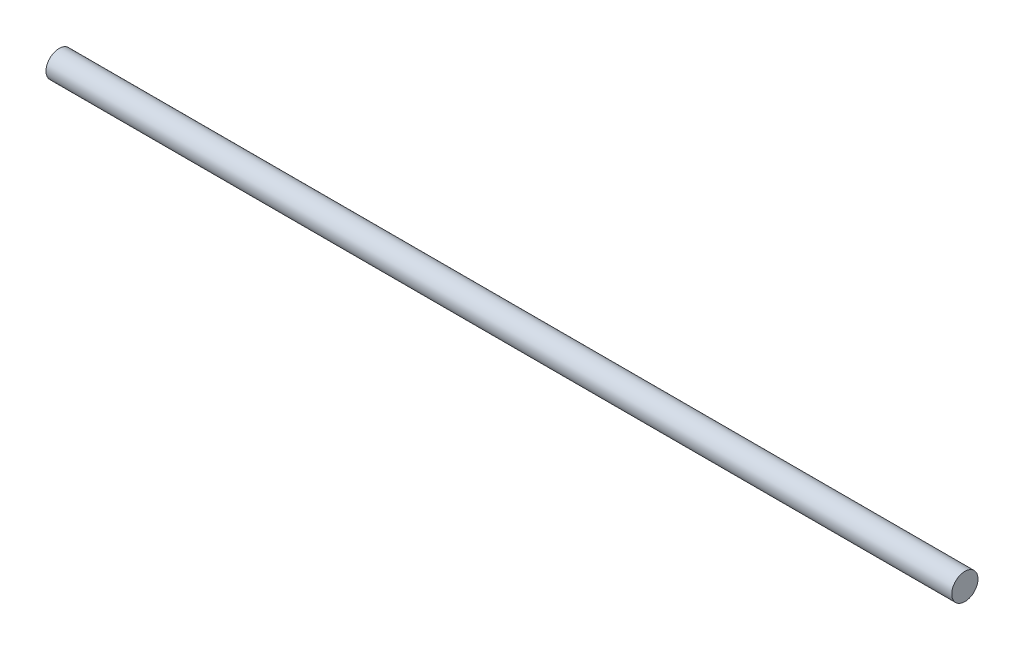
ISO-10303-21;
HEADER;
FILE_DESCRIPTION(('STEP AP214'),'2;1');
FILE_NAME('part.step','',(''),(''),'','','');
FILE_SCHEMA(('AUTOMOTIVE_DESIGN { 1 0 10303 214 1 1 1 1 }'));
ENDSEC;
DATA;
#1=APPLICATION_CONTEXT('core data for automotive mechanical design processes');
#2=APPLICATION_PROTOCOL_DEFINITION('international standard','automotive_design',2000,#1);
#3=PRODUCT_CONTEXT('',#1,'mechanical');
#4=PRODUCT('Part','Part','',(#3));
#5=PRODUCT_RELATED_PRODUCT_CATEGORY('part','',(#4));
#6=PRODUCT_DEFINITION_FORMATION('','',#4);
#7=PRODUCT_DEFINITION_CONTEXT('part definition',#1,'design');
#8=PRODUCT_DEFINITION('design','',#6,#7);
#9=PRODUCT_DEFINITION_SHAPE('','',#8);
#10=(LENGTH_UNIT() NAMED_UNIT(*) SI_UNIT(.MILLI.,.METRE.));
#11=(NAMED_UNIT(*) PLANE_ANGLE_UNIT() SI_UNIT($,.RADIAN.));
#12=(NAMED_UNIT(*) SI_UNIT($,.STERADIAN.) SOLID_ANGLE_UNIT());
#13=UNCERTAINTY_MEASURE_WITH_UNIT(LENGTH_MEASURE(1.E-05),#10,'distance_accuracy_value','');
#14=(GEOMETRIC_REPRESENTATION_CONTEXT(3) GLOBAL_UNCERTAINTY_ASSIGNED_CONTEXT((#13)) GLOBAL_UNIT_ASSIGNED_CONTEXT((#10,
#11,#12)) REPRESENTATION_CONTEXT('',''));
#15=CARTESIAN_POINT('',(0.,0.,0.));
#16=DIRECTION('',(0.,0.,1.));
#17=DIRECTION('',(1.,0.,0.));
#18=AXIS2_PLACEMENT_3D('',#15,#16,#17);
#19=CARTESIAN_POINT('',(276.,0.,0.));
#20=DIRECTION('',(-1.,0.,0.));
#21=DIRECTION('',(0.,0.,1.));
#22=AXIS2_PLACEMENT_3D('',#19,#20,#21);
#23=CYLINDRICAL_SURFACE('',#22,4.);
#24=CARTESIAN_POINT('',(276.,0.,0.));
#25=DIRECTION('',(1.,0.,0.));
#26=DIRECTION('',(0.,0.,-1.));
#27=AXIS2_PLACEMENT_3D('',#24,#25,#26);
#28=CIRCLE('',#27,4.);
#29=CARTESIAN_POINT('',(276.,0.,-4.));
#30=VERTEX_POINT('',#29);
#31=EDGE_CURVE('E10',#30,#30,#28,.T.);
#32=ORIENTED_EDGE('',*,*,#31,.F.);
#33=EDGE_LOOP('',(#32));
#34=FACE_BOUND('',#33,.T.);
#35=CARTESIAN_POINT('',(0.,0.,0.));
#36=DIRECTION('',(1.,0.,0.));
#37=DIRECTION('',(0.,0.,-1.));
#38=AXIS2_PLACEMENT_3D('',#35,#36,#37);
#39=CIRCLE('',#38,4.);
#40=CARTESIAN_POINT('',(0.,0.,-4.));
#41=VERTEX_POINT('',#40);
#42=EDGE_CURVE('E36',#41,#41,#39,.T.);
#43=ORIENTED_EDGE('',*,*,#42,.T.);
#44=EDGE_LOOP('',(#43));
#45=FACE_BOUND('',#44,.T.);
#46=ADVANCED_FACE('F33',(#34,#45),#23,.T.);
#47=CARTESIAN_POINT('',(276.,0.,0.));
#48=DIRECTION('',(1.,0.,0.));
#49=DIRECTION('',(0.,0.,-1.));
#50=AXIS2_PLACEMENT_3D('',#47,#48,#49);
#51=PLANE('',#50);
#52=ORIENTED_EDGE('',*,*,#31,.T.);
#53=EDGE_LOOP('',(#52));
#54=FACE_BOUND('',#53,.T.);
#55=ADVANCED_FACE('F48',(#54),#51,.T.);
#56=CARTESIAN_POINT('',(0.,0.,0.));
#57=DIRECTION('',(1.,0.,0.));
#58=DIRECTION('',(0.,0.,-1.));
#59=AXIS2_PLACEMENT_3D('',#56,#57,#58);
#60=PLANE('',#59);
#61=ORIENTED_EDGE('',*,*,#42,.F.);
#62=EDGE_LOOP('',(#61));
#63=FACE_BOUND('',#62,.T.);
#64=ADVANCED_FACE('F46',(#63),#60,.F.);
#65=CLOSED_SHELL('',(#46,#55,#64));
#66=MANIFOLD_SOLID_BREP('B2',#65);
#67=ADVANCED_BREP_SHAPE_REPRESENTATION('',(#18,#66),#14);
#68=SHAPE_DEFINITION_REPRESENTATION(#9,#67);
ENDSEC;
END-ISO-10303-21;
